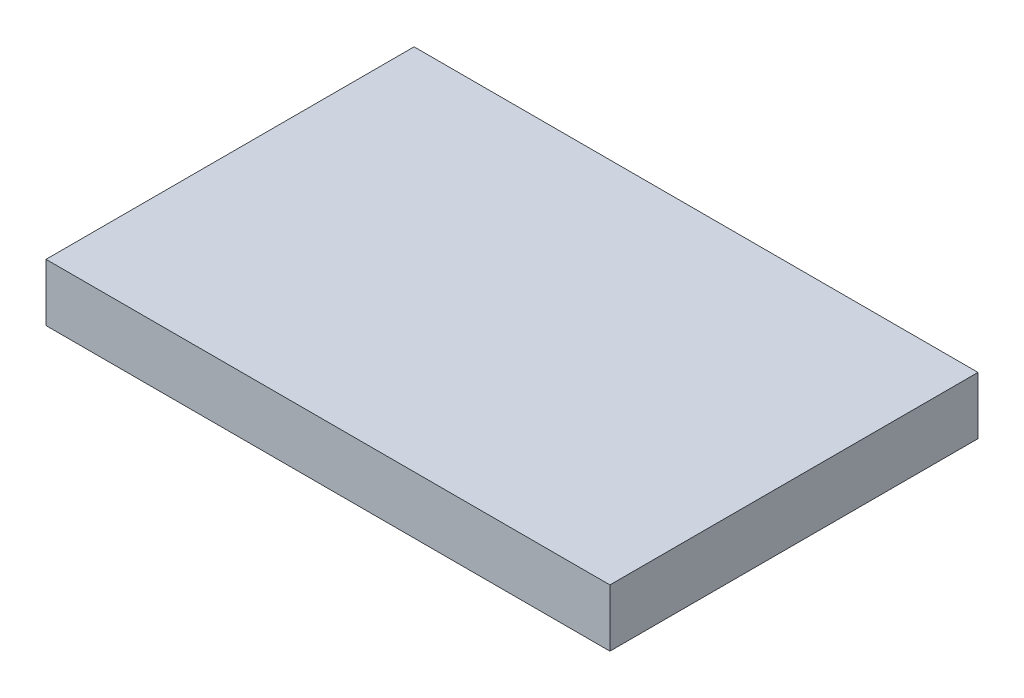
ISO-10303-21;
HEADER;
FILE_DESCRIPTION(('STEP AP214'),'2;1');
FILE_NAME('part.step','',(''),(''),'','','');
FILE_SCHEMA(('AUTOMOTIVE_DESIGN { 1 0 10303 214 1 1 1 1 }'));
ENDSEC;
DATA;
#1=APPLICATION_CONTEXT('core data for automotive mechanical design processes');
#2=APPLICATION_PROTOCOL_DEFINITION('international standard','automotive_design',2000,#1);
#3=PRODUCT_CONTEXT('',#1,'mechanical');
#4=PRODUCT('Part','Part','',(#3));
#5=PRODUCT_RELATED_PRODUCT_CATEGORY('part','',(#4));
#6=PRODUCT_DEFINITION_FORMATION('','',#4);
#7=PRODUCT_DEFINITION_CONTEXT('part definition',#1,'design');
#8=PRODUCT_DEFINITION('design','',#6,#7);
#9=PRODUCT_DEFINITION_SHAPE('','',#8);
#10=(LENGTH_UNIT() NAMED_UNIT(*) SI_UNIT(.MILLI.,.METRE.));
#11=(NAMED_UNIT(*) PLANE_ANGLE_UNIT() SI_UNIT($,.RADIAN.));
#12=(NAMED_UNIT(*) SI_UNIT($,.STERADIAN.) SOLID_ANGLE_UNIT());
#13=UNCERTAINTY_MEASURE_WITH_UNIT(LENGTH_MEASURE(1.E-05),#10,'distance_accuracy_value','');
#14=(GEOMETRIC_REPRESENTATION_CONTEXT(3) GLOBAL_UNCERTAINTY_ASSIGNED_CONTEXT((#13)) GLOBAL_UNIT_ASSIGNED_CONTEXT((#10,
#11,#12)) REPRESENTATION_CONTEXT('',''));
#15=CARTESIAN_POINT('',(0.,0.,0.));
#16=DIRECTION('',(0.,0.,1.));
#17=DIRECTION('',(1.,0.,0.));
#18=AXIS2_PLACEMENT_3D('',#15,#16,#17);
#19=CARTESIAN_POINT('',(41.75,8.5,-27.25));
#20=DIRECTION('',(-1.,0.,0.));
#21=DIRECTION('',(0.,0.,1.));
#22=AXIS2_PLACEMENT_3D('',#19,#20,#21);
#23=PLANE('',#22);
#24=DIRECTION('',(0.,0.,-1.));
#25=VECTOR('',#24,1.);
#26=CARTESIAN_POINT('',(41.75,0.,-27.25));
#27=LINE('',#26,#25);
#28=CARTESIAN_POINT('',(41.75,0.,27.25));
#29=VERTEX_POINT('',#28);
#30=CARTESIAN_POINT('',(41.75,0.,-27.25));
#31=VERTEX_POINT('',#30);
#32=EDGE_CURVE('E99',#29,#31,#27,.T.);
#33=ORIENTED_EDGE('',*,*,#32,.T.);
#34=DIRECTION('',(0.,-1.,0.));
#35=VECTOR('',#34,1.);
#36=CARTESIAN_POINT('',(41.75,8.5,-27.25));
#37=LINE('',#36,#35);
#38=CARTESIAN_POINT('',(41.75,8.5,-27.25));
#39=VERTEX_POINT('',#38);
#40=EDGE_CURVE('E11',#39,#31,#37,.T.);
#41=ORIENTED_EDGE('',*,*,#40,.F.);
#42=DIRECTION('',(0.,0.,-1.));
#43=VECTOR('',#42,1.);
#44=CARTESIAN_POINT('',(41.75,8.5,-27.25));
#45=LINE('',#44,#43);
#46=CARTESIAN_POINT('',(41.75,8.5,27.25));
#47=VERTEX_POINT('',#46);
#48=EDGE_CURVE('E87',#47,#39,#45,.T.);
#49=ORIENTED_EDGE('',*,*,#48,.F.);
#50=DIRECTION('',(0.,-1.,0.));
#51=VECTOR('',#50,1.);
#52=CARTESIAN_POINT('',(41.75,8.5,27.25));
#53=LINE('',#52,#51);
#54=EDGE_CURVE('E95',#47,#29,#53,.T.);
#55=ORIENTED_EDGE('',*,*,#54,.T.);
#56=EDGE_LOOP('',(#33,#41,#49,#55));
#57=FACE_BOUND('',#56,.T.);
#58=ADVANCED_FACE('F36',(#57),#23,.F.);
#59=CARTESIAN_POINT('',(-41.75,8.5,-27.25));
#60=DIRECTION('',(0.,0.,1.));
#61=DIRECTION('',(1.,0.,0.));
#62=AXIS2_PLACEMENT_3D('',#59,#60,#61);
#63=PLANE('',#62);
#64=DIRECTION('',(-1.,0.,0.));
#65=VECTOR('',#64,1.);
#66=CARTESIAN_POINT('',(-41.75,0.,-27.25));
#67=LINE('',#66,#65);
#68=CARTESIAN_POINT('',(-41.75,0.,-27.25));
#69=VERTEX_POINT('',#68);
#70=EDGE_CURVE('E91',#31,#69,#67,.T.);
#71=ORIENTED_EDGE('',*,*,#70,.T.);
#72=DIRECTION('',(0.,-1.,0.));
#73=VECTOR('',#72,1.);
#74=CARTESIAN_POINT('',(-41.75,8.5,-27.25));
#75=LINE('',#74,#73);
#76=CARTESIAN_POINT('',(-41.75,8.5,-27.25));
#77=VERTEX_POINT('',#76);
#78=EDGE_CURVE('E44',#77,#69,#75,.T.);
#79=ORIENTED_EDGE('',*,*,#78,.F.);
#80=DIRECTION('',(-1.,0.,0.));
#81=VECTOR('',#80,1.);
#82=CARTESIAN_POINT('',(-41.75,8.5,-27.25));
#83=LINE('',#82,#81);
#84=EDGE_CURVE('E82',#39,#77,#83,.T.);
#85=ORIENTED_EDGE('',*,*,#84,.F.);
#86=ORIENTED_EDGE('',*,*,#40,.T.);
#87=EDGE_LOOP('',(#71,#79,#85,#86));
#88=FACE_BOUND('',#87,.T.);
#89=ADVANCED_FACE('F90',(#88),#63,.F.);
#90=CARTESIAN_POINT('',(-41.75,8.5,-27.25));
#91=DIRECTION('',(1.,0.,0.));
#92=DIRECTION('',(0.,0.,-1.));
#93=AXIS2_PLACEMENT_3D('',#90,#91,#92);
#94=PLANE('',#93);
#95=DIRECTION('',(0.,0.,1.));
#96=VECTOR('',#95,1.);
#97=CARTESIAN_POINT('',(-41.75,0.,-27.25));
#98=LINE('',#97,#96);
#99=CARTESIAN_POINT('',(-41.75,0.,27.25));
#100=VERTEX_POINT('',#99);
#101=EDGE_CURVE('E69',#69,#100,#98,.T.);
#102=ORIENTED_EDGE('',*,*,#101,.T.);
#103=DIRECTION('',(0.,-1.,0.));
#104=VECTOR('',#103,1.);
#105=CARTESIAN_POINT('',(-41.75,8.5,27.25));
#106=LINE('',#105,#104);
#107=CARTESIAN_POINT('',(-41.75,8.5,27.25));
#108=VERTEX_POINT('',#107);
#109=EDGE_CURVE('E92',#108,#100,#106,.T.);
#110=ORIENTED_EDGE('',*,*,#109,.F.);
#111=DIRECTION('',(0.,0.,1.));
#112=VECTOR('',#111,1.);
#113=CARTESIAN_POINT('',(-41.75,8.5,-27.25));
#114=LINE('',#113,#112);
#115=EDGE_CURVE('E85',#77,#108,#114,.T.);
#116=ORIENTED_EDGE('',*,*,#115,.F.);
#117=ORIENTED_EDGE('',*,*,#78,.T.);
#118=EDGE_LOOP('',(#102,#110,#116,#117));
#119=FACE_BOUND('',#118,.T.);
#120=ADVANCED_FACE('F93',(#119),#94,.F.);
#121=CARTESIAN_POINT('',(-41.75,8.5,27.25));
#122=DIRECTION('',(0.,0.,-1.));
#123=DIRECTION('',(-1.,0.,0.));
#124=AXIS2_PLACEMENT_3D('',#121,#122,#123);
#125=PLANE('',#124);
#126=DIRECTION('',(1.,0.,0.));
#127=VECTOR('',#126,1.);
#128=CARTESIAN_POINT('',(-41.75,0.,27.25));
#129=LINE('',#128,#127);
#130=EDGE_CURVE('E75',#100,#29,#129,.T.);
#131=ORIENTED_EDGE('',*,*,#130,.T.);
#132=ORIENTED_EDGE('',*,*,#54,.F.);
#133=DIRECTION('',(1.,0.,0.));
#134=VECTOR('',#133,1.);
#135=CARTESIAN_POINT('',(-41.75,8.5,27.25));
#136=LINE('',#135,#134);
#137=EDGE_CURVE('E52',#108,#47,#136,.T.);
#138=ORIENTED_EDGE('',*,*,#137,.F.);
#139=ORIENTED_EDGE('',*,*,#109,.T.);
#140=EDGE_LOOP('',(#131,#132,#138,#139));
#141=FACE_BOUND('',#140,.T.);
#142=ADVANCED_FACE('F106',(#141),#125,.F.);
#143=CARTESIAN_POINT('',(0.,8.5,0.));
#144=DIRECTION('',(0.,1.,0.));
#145=DIRECTION('',(0.,0.,1.));
#146=AXIS2_PLACEMENT_3D('',#143,#144,#145);
#147=PLANE('',#146);
#148=ORIENTED_EDGE('',*,*,#48,.T.);
#149=ORIENTED_EDGE('',*,*,#84,.T.);
#150=ORIENTED_EDGE('',*,*,#115,.T.);
#151=ORIENTED_EDGE('',*,*,#137,.T.);
#152=EDGE_LOOP('',(#148,#149,#150,#151));
#153=FACE_BOUND('',#152,.T.);
#154=ADVANCED_FACE('F83',(#153),#147,.T.);
#155=CARTESIAN_POINT('',(0.,0.,0.));
#156=DIRECTION('',(0.,1.,0.));
#157=DIRECTION('',(0.,0.,1.));
#158=AXIS2_PLACEMENT_3D('',#155,#156,#157);
#159=PLANE('',#158);
#160=ORIENTED_EDGE('',*,*,#32,.F.);
#161=ORIENTED_EDGE('',*,*,#130,.F.);
#162=ORIENTED_EDGE('',*,*,#101,.F.);
#163=ORIENTED_EDGE('',*,*,#70,.F.);
#164=EDGE_LOOP('',(#160,#161,#162,#163));
#165=FACE_BOUND('',#164,.T.);
#166=ADVANCED_FACE('F109',(#165),#159,.F.);
#167=CLOSED_SHELL('',(#58,#89,#120,#142,#154,#166));
#168=MANIFOLD_SOLID_BREP('B2',#167);
#169=ADVANCED_BREP_SHAPE_REPRESENTATION('',(#18,#168),#14);
#170=SHAPE_DEFINITION_REPRESENTATION(#9,#169);
ENDSEC;
END-ISO-10303-21;
